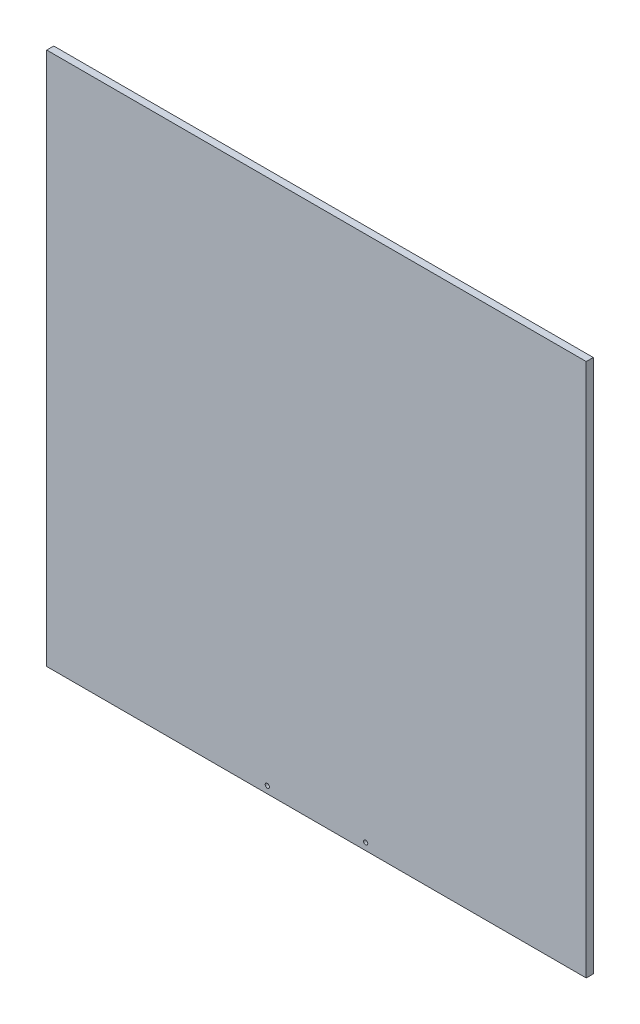
ISO-10303-21;
HEADER;
FILE_DESCRIPTION(('STEP AP214'),'2;1');
FILE_NAME('part.step','',(''),(''),'','','');
FILE_SCHEMA(('AUTOMOTIVE_DESIGN { 1 0 10303 214 1 1 1 1 }'));
ENDSEC;
DATA;
#1=APPLICATION_CONTEXT('core data for automotive mechanical design processes');
#2=APPLICATION_PROTOCOL_DEFINITION('international standard','automotive_design',2000,#1);
#3=PRODUCT_CONTEXT('',#1,'mechanical');
#4=PRODUCT('Part','Part','',(#3));
#5=PRODUCT_RELATED_PRODUCT_CATEGORY('part','',(#4));
#6=PRODUCT_DEFINITION_FORMATION('','',#4);
#7=PRODUCT_DEFINITION_CONTEXT('part definition',#1,'design');
#8=PRODUCT_DEFINITION('design','',#6,#7);
#9=PRODUCT_DEFINITION_SHAPE('','',#8);
#10=(LENGTH_UNIT() NAMED_UNIT(*) SI_UNIT(.MILLI.,.METRE.));
#11=(NAMED_UNIT(*) PLANE_ANGLE_UNIT() SI_UNIT($,.RADIAN.));
#12=(NAMED_UNIT(*) SI_UNIT($,.STERADIAN.) SOLID_ANGLE_UNIT());
#13=UNCERTAINTY_MEASURE_WITH_UNIT(LENGTH_MEASURE(1.E-05),#10,'distance_accuracy_value','');
#14=(GEOMETRIC_REPRESENTATION_CONTEXT(3) GLOBAL_UNCERTAINTY_ASSIGNED_CONTEXT((#13)) GLOBAL_UNIT_ASSIGNED_CONTEXT((#10,
#11,#12)) REPRESENTATION_CONTEXT('',''));
#15=CARTESIAN_POINT('',(0.,0.,0.));
#16=DIRECTION('',(0.,0.,1.));
#17=DIRECTION('',(1.,0.,0.));
#18=AXIS2_PLACEMENT_3D('',#15,#16,#17);
#19=CARTESIAN_POINT('',(192.,190.,5.));
#20=DIRECTION('',(-1.,0.,0.));
#21=DIRECTION('',(0.,-1.,0.));
#22=AXIS2_PLACEMENT_3D('',#19,#20,#21);
#23=PLANE('',#22);
#24=DIRECTION('',(0.,1.,0.));
#25=VECTOR('',#24,1.);
#26=CARTESIAN_POINT('',(192.,190.,0.));
#27=LINE('',#26,#25);
#28=CARTESIAN_POINT('',(192.,-190.,0.));
#29=VERTEX_POINT('',#28);
#30=CARTESIAN_POINT('',(192.,190.,0.));
#31=VERTEX_POINT('',#30);
#32=EDGE_CURVE('E74',#29,#31,#27,.T.);
#33=ORIENTED_EDGE('',*,*,#32,.T.);
#34=DIRECTION('',(0.,0.,-1.));
#35=VECTOR('',#34,1.);
#36=CARTESIAN_POINT('',(192.,190.,5.));
#37=LINE('',#36,#35);
#38=CARTESIAN_POINT('',(192.,190.,5.));
#39=VERTEX_POINT('',#38);
#40=EDGE_CURVE('E11',#39,#31,#37,.T.);
#41=ORIENTED_EDGE('',*,*,#40,.F.);
#42=DIRECTION('',(0.,1.,0.));
#43=VECTOR('',#42,1.);
#44=CARTESIAN_POINT('',(192.,-107.5,5.));
#45=LINE('',#44,#43);
#46=CARTESIAN_POINT('',(192.,-190.,5.));
#47=VERTEX_POINT('',#46);
#48=EDGE_CURVE('E79',#47,#39,#45,.T.);
#49=ORIENTED_EDGE('',*,*,#48,.F.);
#50=DIRECTION('',(0.,0.,-1.));
#51=VECTOR('',#50,1.);
#52=CARTESIAN_POINT('',(192.,-190.,5.));
#53=LINE('',#52,#51);
#54=EDGE_CURVE('E95',#47,#29,#53,.T.);
#55=ORIENTED_EDGE('',*,*,#54,.T.);
#56=EDGE_LOOP('',(#33,#41,#49,#55));
#57=FACE_BOUND('',#56,.T.);
#58=ADVANCED_FACE('F35',(#57),#23,.F.);
#59=CARTESIAN_POINT('',(-192.,190.,5.));
#60=DIRECTION('',(0.,-1.,0.));
#61=DIRECTION('',(1.,0.,0.));
#62=AXIS2_PLACEMENT_3D('',#59,#60,#61);
#63=PLANE('',#62);
#64=DIRECTION('',(-1.,0.,0.));
#65=VECTOR('',#64,1.);
#66=CARTESIAN_POINT('',(-192.,190.,0.));
#67=LINE('',#66,#65);
#68=CARTESIAN_POINT('',(-192.,190.,0.));
#69=VERTEX_POINT('',#68);
#70=EDGE_CURVE('E91',#31,#69,#67,.T.);
#71=ORIENTED_EDGE('',*,*,#70,.T.);
#72=DIRECTION('',(0.,0.,-1.));
#73=VECTOR('',#72,1.);
#74=CARTESIAN_POINT('',(-192.,190.,5.));
#75=LINE('',#74,#73);
#76=CARTESIAN_POINT('',(-192.,190.,5.));
#77=VERTEX_POINT('',#76);
#78=EDGE_CURVE('E43',#77,#69,#75,.T.);
#79=ORIENTED_EDGE('',*,*,#78,.F.);
#80=DIRECTION('',(-1.,0.,0.));
#81=VECTOR('',#80,1.);
#82=CARTESIAN_POINT('',(-192.,190.,5.));
#83=LINE('',#82,#81);
#84=EDGE_CURVE('E82',#39,#77,#83,.T.);
#85=ORIENTED_EDGE('',*,*,#84,.F.);
#86=ORIENTED_EDGE('',*,*,#40,.T.);
#87=EDGE_LOOP('',(#71,#79,#85,#86));
#88=FACE_BOUND('',#87,.T.);
#89=ADVANCED_FACE('F90',(#88),#63,.F.);
#90=CARTESIAN_POINT('',(-192.,-87.5000000000003,5.));
#91=DIRECTION('',(1.,0.,0.));
#92=DIRECTION('',(0.,0.,-1.));
#93=AXIS2_PLACEMENT_3D('',#90,#91,#92);
#94=PLANE('',#93);
#95=DIRECTION('',(0.,-1.,0.));
#96=VECTOR('',#95,1.);
#97=CARTESIAN_POINT('',(-192.,-87.5000000000003,0.));
#98=LINE('',#97,#96);
#99=CARTESIAN_POINT('',(-192.,-190.,0.));
#100=VERTEX_POINT('',#99);
#101=EDGE_CURVE('E67',#69,#100,#98,.T.);
#102=ORIENTED_EDGE('',*,*,#101,.T.);
#103=DIRECTION('',(0.,0.,-1.));
#104=VECTOR('',#103,1.);
#105=CARTESIAN_POINT('',(-192.,-190.,5.));
#106=LINE('',#105,#104);
#107=CARTESIAN_POINT('',(-192.,-190.,5.));
#108=VERTEX_POINT('',#107);
#109=EDGE_CURVE('E92',#108,#100,#106,.T.);
#110=ORIENTED_EDGE('',*,*,#109,.F.);
#111=DIRECTION('',(0.,-1.,0.));
#112=VECTOR('',#111,1.);
#113=CARTESIAN_POINT('',(-192.,190.,5.));
#114=LINE('',#113,#112);
#115=EDGE_CURVE('E86',#77,#108,#114,.T.);
#116=ORIENTED_EDGE('',*,*,#115,.F.);
#117=ORIENTED_EDGE('',*,*,#78,.T.);
#118=EDGE_LOOP('',(#102,#110,#116,#117));
#119=FACE_BOUND('',#118,.T.);
#120=ADVANCED_FACE('F93',(#119),#94,.F.);
#121=CARTESIAN_POINT('',(-192.,-190.,5.));
#122=DIRECTION('',(0.,1.,0.));
#123=DIRECTION('',(-1.,0.,0.));
#124=AXIS2_PLACEMENT_3D('',#121,#122,#123);
#125=PLANE('',#124);
#126=DIRECTION('',(1.,0.,0.));
#127=VECTOR('',#126,1.);
#128=CARTESIAN_POINT('',(-192.,-190.,0.));
#129=LINE('',#128,#127);
#130=EDGE_CURVE('E103',#100,#29,#129,.T.);
#131=ORIENTED_EDGE('',*,*,#130,.T.);
#132=ORIENTED_EDGE('',*,*,#54,.F.);
#133=DIRECTION('',(1.,0.,0.));
#134=VECTOR('',#133,1.);
#135=CARTESIAN_POINT('',(-192.,-190.,5.));
#136=LINE('',#135,#134);
#137=EDGE_CURVE('E51',#108,#47,#136,.T.);
#138=ORIENTED_EDGE('',*,*,#137,.F.);
#139=ORIENTED_EDGE('',*,*,#109,.T.);
#140=EDGE_LOOP('',(#131,#132,#138,#139));
#141=FACE_BOUND('',#140,.T.);
#142=ADVANCED_FACE('F108',(#141),#125,.F.);
#143=CARTESIAN_POINT('',(0.,0.,5.));
#144=DIRECTION('',(0.,0.,1.));
#145=DIRECTION('',(1.,0.,0.));
#146=AXIS2_PLACEMENT_3D('',#143,#144,#145);
#147=PLANE('',#146);
#148=CARTESIAN_POINT('',(-35.0000000000076,-184.999999999995,5.));
#149=DIRECTION('',(0.,0.,-1.));
#150=DIRECTION('',(-1.,0.,0.));
#151=AXIS2_PLACEMENT_3D('',#148,#149,#150);
#152=CIRCLE('',#151,1.50000000001436);
#153=CARTESIAN_POINT('',(-36.5000000000219,-184.999999999995,5.));
#154=VERTEX_POINT('',#153);
#155=EDGE_CURVE('E100',#154,#154,#152,.T.);
#156=ORIENTED_EDGE('',*,*,#155,.T.);
#157=EDGE_LOOP('',(#156));
#158=FACE_BOUND('',#157,.T.);
#159=CARTESIAN_POINT('',(34.999999999992,-184.999999999994,5.));
#160=DIRECTION('',(0.,0.,-1.));
#161=DIRECTION('',(-1.,0.,0.));
#162=AXIS2_PLACEMENT_3D('',#159,#160,#161);
#163=CIRCLE('',#162,1.49999999998272);
#164=CARTESIAN_POINT('',(33.5000000000093,-184.999999999994,5.));
#165=VERTEX_POINT('',#164);
#166=EDGE_CURVE('E136',#165,#165,#163,.T.);
#167=ORIENTED_EDGE('',*,*,#166,.T.);
#168=EDGE_LOOP('',(#167));
#169=FACE_BOUND('',#168,.T.);
#170=ORIENTED_EDGE('',*,*,#48,.T.);
#171=ORIENTED_EDGE('',*,*,#84,.T.);
#172=ORIENTED_EDGE('',*,*,#115,.T.);
#173=ORIENTED_EDGE('',*,*,#137,.T.);
#174=EDGE_LOOP('',(#170,#171,#172,#173));
#175=FACE_BOUND('',#174,.T.);
#176=ADVANCED_FACE('F84',(#158,#169,#175),#147,.T.);
#177=CARTESIAN_POINT('',(0.,0.,0.));
#178=DIRECTION('',(0.,0.,1.));
#179=DIRECTION('',(1.,0.,0.));
#180=AXIS2_PLACEMENT_3D('',#177,#178,#179);
#181=PLANE('',#180);
#182=CARTESIAN_POINT('',(-35.0000000000076,-184.999999999995,0.));
#183=DIRECTION('',(0.,0.,-1.));
#184=DIRECTION('',(-1.,0.,0.));
#185=AXIS2_PLACEMENT_3D('',#182,#183,#184);
#186=CIRCLE('',#185,1.50000000001436);
#187=CARTESIAN_POINT('',(-36.5000000000219,-184.999999999995,0.));
#188=VERTEX_POINT('',#187);
#189=EDGE_CURVE('E139',#188,#188,#186,.T.);
#190=ORIENTED_EDGE('',*,*,#189,.F.);
#191=EDGE_LOOP('',(#190));
#192=FACE_BOUND('',#191,.T.);
#193=CARTESIAN_POINT('',(34.999999999992,-184.999999999994,0.));
#194=DIRECTION('',(0.,0.,-1.));
#195=DIRECTION('',(-1.,0.,0.));
#196=AXIS2_PLACEMENT_3D('',#193,#194,#195);
#197=CIRCLE('',#196,1.49999999998272);
#198=CARTESIAN_POINT('',(33.5000000000093,-184.999999999994,0.));
#199=VERTEX_POINT('',#198);
#200=EDGE_CURVE('E133',#199,#199,#197,.T.);
#201=ORIENTED_EDGE('',*,*,#200,.F.);
#202=EDGE_LOOP('',(#201));
#203=FACE_BOUND('',#202,.T.);
#204=ORIENTED_EDGE('',*,*,#32,.F.);
#205=ORIENTED_EDGE('',*,*,#130,.F.);
#206=ORIENTED_EDGE('',*,*,#101,.F.);
#207=ORIENTED_EDGE('',*,*,#70,.F.);
#208=EDGE_LOOP('',(#204,#205,#206,#207));
#209=FACE_BOUND('',#208,.T.);
#210=ADVANCED_FACE('F109',(#192,#203,#209),#181,.F.);
#211=CARTESIAN_POINT('',(34.999999999992,-184.999999999994,5.));
#212=DIRECTION('',(0.,0.,-1.));
#213=DIRECTION('',(-1.,0.,0.));
#214=AXIS2_PLACEMENT_3D('',#211,#212,#213);
#215=CYLINDRICAL_SURFACE('',#214,1.49999999998272);
#216=ORIENTED_EDGE('',*,*,#166,.F.);
#217=EDGE_LOOP('',(#216));
#218=FACE_BOUND('',#217,.T.);
#219=ORIENTED_EDGE('',*,*,#200,.T.);
#220=EDGE_LOOP('',(#219));
#221=FACE_BOUND('',#220,.T.);
#222=ADVANCED_FACE('F111',(#218,#221),#215,.F.);
#223=CARTESIAN_POINT('',(-35.0000000000076,-184.999999999995,5.));
#224=DIRECTION('',(0.,0.,-1.));
#225=DIRECTION('',(-1.,0.,0.));
#226=AXIS2_PLACEMENT_3D('',#223,#224,#225);
#227=CYLINDRICAL_SURFACE('',#226,1.50000000001436);
#228=ORIENTED_EDGE('',*,*,#155,.F.);
#229=EDGE_LOOP('',(#228));
#230=FACE_BOUND('',#229,.T.);
#231=ORIENTED_EDGE('',*,*,#189,.T.);
#232=EDGE_LOOP('',(#231));
#233=FACE_BOUND('',#232,.T.);
#234=ADVANCED_FACE('F119',(#230,#233),#227,.F.);
#235=CLOSED_SHELL('',(#58,#89,#120,#142,#176,#210,#222,#234));
#236=MANIFOLD_SOLID_BREP('B2',#235);
#237=ADVANCED_BREP_SHAPE_REPRESENTATION('',(#18,#236),#14);
#238=SHAPE_DEFINITION_REPRESENTATION(#9,#237);
ENDSEC;
END-ISO-10303-21;
